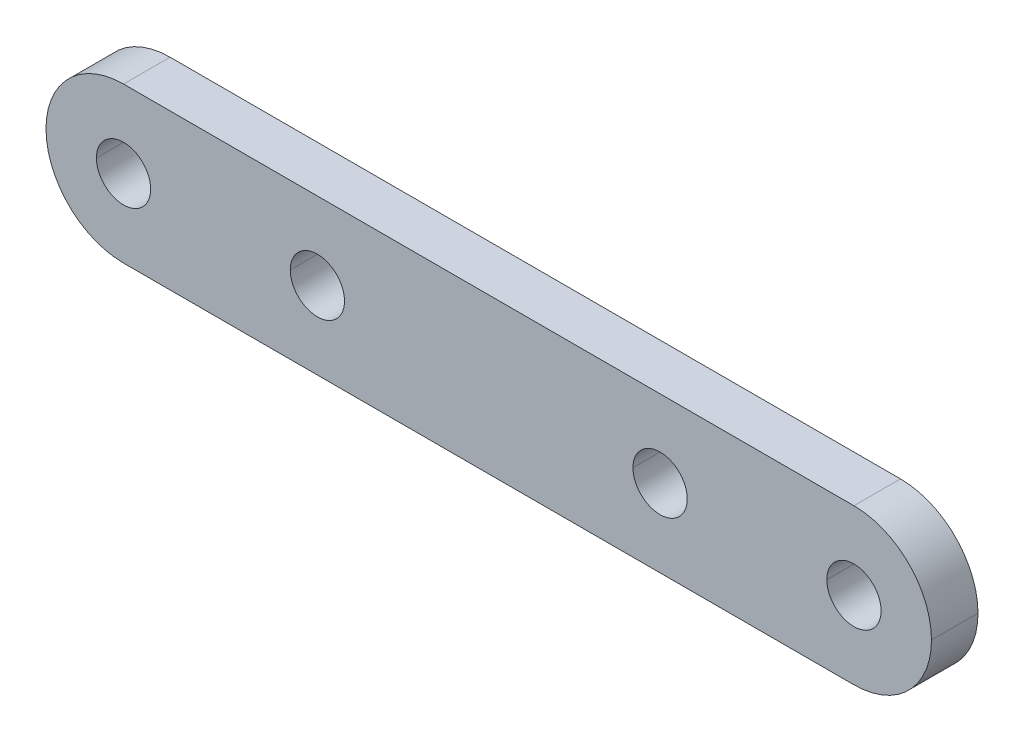
ISO-10303-21;
HEADER;
FILE_DESCRIPTION(('STEP AP214'),'2;1');
FILE_NAME('part.step','',(''),(''),'','','');
FILE_SCHEMA(('AUTOMOTIVE_DESIGN { 1 0 10303 214 1 1 1 1 }'));
ENDSEC;
DATA;
#1=APPLICATION_CONTEXT('core data for automotive mechanical design processes');
#2=APPLICATION_PROTOCOL_DEFINITION('international standard','automotive_design',2000,#1);
#3=PRODUCT_CONTEXT('',#1,'mechanical');
#4=PRODUCT('Part','Part','',(#3));
#5=PRODUCT_RELATED_PRODUCT_CATEGORY('part','',(#4));
#6=PRODUCT_DEFINITION_FORMATION('','',#4);
#7=PRODUCT_DEFINITION_CONTEXT('part definition',#1,'design');
#8=PRODUCT_DEFINITION('design','',#6,#7);
#9=PRODUCT_DEFINITION_SHAPE('','',#8);
#10=(LENGTH_UNIT() NAMED_UNIT(*) SI_UNIT(.MILLI.,.METRE.));
#11=(NAMED_UNIT(*) PLANE_ANGLE_UNIT() SI_UNIT($,.RADIAN.));
#12=(NAMED_UNIT(*) SI_UNIT($,.STERADIAN.) SOLID_ANGLE_UNIT());
#13=UNCERTAINTY_MEASURE_WITH_UNIT(LENGTH_MEASURE(1.E-05),#10,'distance_accuracy_value','');
#14=(GEOMETRIC_REPRESENTATION_CONTEXT(3) GLOBAL_UNCERTAINTY_ASSIGNED_CONTEXT((#13)) GLOBAL_UNIT_ASSIGNED_CONTEXT((#10,
#11,#12)) REPRESENTATION_CONTEXT('',''));
#15=CARTESIAN_POINT('',(0.,0.,0.));
#16=DIRECTION('',(0.,0.,1.));
#17=DIRECTION('',(1.,0.,0.));
#18=AXIS2_PLACEMENT_3D('',#15,#16,#17);
#19=CARTESIAN_POINT('',(11.0499999999999,6.,14.9713085751982));
#20=DIRECTION('',(0.,0.,1.));
#21=DIRECTION('',(1.,0.,0.));
#22=AXIS2_PLACEMENT_3D('',#19,#20,#21);
#23=CYLINDRICAL_SURFACE('',#22,1.75);
#24=DIRECTION('',(0.,0.,1.));
#25=VECTOR('',#24,1.);
#26=CARTESIAN_POINT('',(9.29999999999988,6.,14.9713085751982));
#27=LINE('',#26,#25);
#28=CARTESIAN_POINT('',(9.29999999999988,6.,14.9713085751982));
#29=VERTEX_POINT('',#28);
#30=CARTESIAN_POINT('',(9.29999999999987,6.,17.9713085751983));
#31=VERTEX_POINT('',#30);
#32=EDGE_CURVE('E240',#29,#31,#27,.T.);
#33=ORIENTED_EDGE('',*,*,#32,.F.);
#34=CARTESIAN_POINT('',(11.0499999999999,6.,14.9713085751982));
#35=DIRECTION('',(0.,0.,-1.));
#36=DIRECTION('',(-1.,0.,0.));
#37=AXIS2_PLACEMENT_3D('',#34,#35,#36);
#38=CIRCLE('',#37,1.75);
#39=CARTESIAN_POINT('',(12.7999999999999,6.,14.9713085751982));
#40=VERTEX_POINT('',#39);
#41=EDGE_CURVE('E87',#29,#40,#38,.T.);
#42=ORIENTED_EDGE('',*,*,#41,.T.);
#43=DIRECTION('',(0.,0.,1.));
#44=VECTOR('',#43,1.);
#45=CARTESIAN_POINT('',(12.7999999999999,6.,14.9713085751982));
#46=LINE('',#45,#44);
#47=CARTESIAN_POINT('',(12.7999999999999,6.,17.9713085751983));
#48=VERTEX_POINT('',#47);
#49=EDGE_CURVE('E228',#40,#48,#46,.T.);
#50=ORIENTED_EDGE('',*,*,#49,.T.);
#51=CARTESIAN_POINT('',(11.0499999999999,6.,17.9713085751983));
#52=DIRECTION('',(0.,0.,-1.));
#53=DIRECTION('',(-1.,0.,0.));
#54=AXIS2_PLACEMENT_3D('',#51,#52,#53);
#55=CIRCLE('',#54,1.75);
#56=EDGE_CURVE('E107',#31,#48,#55,.T.);
#57=ORIENTED_EDGE('',*,*,#56,.F.);
#58=EDGE_LOOP('',(#33,#42,#50,#57));
#59=FACE_BOUND('',#58,.T.);
#60=ADVANCED_FACE('F16',(#59),#23,.F.);
#61=CARTESIAN_POINT('',(23.55,6.,14.9713085751983));
#62=DIRECTION('',(0.,0.,1.));
#63=DIRECTION('',(1.,0.,0.));
#64=AXIS2_PLACEMENT_3D('',#61,#62,#63);
#65=CYLINDRICAL_SURFACE('',#64,1.75);
#66=DIRECTION('',(0.,0.,1.));
#67=VECTOR('',#66,1.);
#68=CARTESIAN_POINT('',(21.8,6.,14.9713085751983));
#69=LINE('',#68,#67);
#70=CARTESIAN_POINT('',(21.8,6.,14.9713085751983));
#71=VERTEX_POINT('',#70);
#72=CARTESIAN_POINT('',(21.8,6.,17.9713085751983));
#73=VERTEX_POINT('',#72);
#74=EDGE_CURVE('E211',#71,#73,#69,.T.);
#75=ORIENTED_EDGE('',*,*,#74,.F.);
#76=CARTESIAN_POINT('',(23.55,6.,14.9713085751983));
#77=DIRECTION('',(0.,0.,-1.));
#78=DIRECTION('',(-1.,0.,0.));
#79=AXIS2_PLACEMENT_3D('',#76,#77,#78);
#80=CIRCLE('',#79,1.75);
#81=CARTESIAN_POINT('',(25.3,6.,14.9713085751983));
#82=VERTEX_POINT('',#81);
#83=EDGE_CURVE('E143',#71,#82,#80,.T.);
#84=ORIENTED_EDGE('',*,*,#83,.T.);
#85=DIRECTION('',(0.,0.,1.));
#86=VECTOR('',#85,1.);
#87=CARTESIAN_POINT('',(25.3,6.,14.9713085751983));
#88=LINE('',#87,#86);
#89=CARTESIAN_POINT('',(25.3,6.,17.9713085751983));
#90=VERTEX_POINT('',#89);
#91=EDGE_CURVE('E203',#82,#90,#88,.T.);
#92=ORIENTED_EDGE('',*,*,#91,.T.);
#93=CARTESIAN_POINT('',(23.55,6.,17.9713085751983));
#94=DIRECTION('',(0.,0.,-1.));
#95=DIRECTION('',(-1.,0.,0.));
#96=AXIS2_PLACEMENT_3D('',#93,#94,#95);
#97=CIRCLE('',#96,1.75);
#98=EDGE_CURVE('E103',#73,#90,#97,.T.);
#99=ORIENTED_EDGE('',*,*,#98,.F.);
#100=EDGE_LOOP('',(#75,#84,#92,#99));
#101=FACE_BOUND('',#100,.T.);
#102=ADVANCED_FACE('F465',(#101),#65,.F.);
#103=CARTESIAN_POINT('',(0.,0.999999999999965,14.9713085751982));
#104=DIRECTION('',(0.,1.,0.));
#105=DIRECTION('',(1.,0.,0.));
#106=AXIS2_PLACEMENT_3D('',#103,#104,#105);
#107=PLANE('',#106);
#108=DIRECTION('',(-1.,0.,0.));
#109=VECTOR('',#108,1.);
#110=CARTESIAN_POINT('',(0.,0.999999999999966,17.9713085751982));
#111=LINE('',#110,#109);
#112=CARTESIAN_POINT('',(23.55,1.,17.9713085751983));
#113=VERTEX_POINT('',#112);
#114=CARTESIAN_POINT('',(-23.55,0.999999999999933,17.9713085751982));
#115=VERTEX_POINT('',#114);
#116=EDGE_CURVE('E72',#113,#115,#111,.T.);
#117=ORIENTED_EDGE('',*,*,#116,.T.);
#118=DIRECTION('',(0.,0.,1.));
#119=VECTOR('',#118,1.);
#120=CARTESIAN_POINT('',(-23.55,0.999999999999933,14.9713085751982));
#121=LINE('',#120,#119);
#122=CARTESIAN_POINT('',(-23.55,0.999999999999933,14.9713085751982));
#123=VERTEX_POINT('',#122);
#124=EDGE_CURVE('E26',#123,#115,#121,.T.);
#125=ORIENTED_EDGE('',*,*,#124,.F.);
#126=DIRECTION('',(-1.,0.,0.));
#127=VECTOR('',#126,1.);
#128=CARTESIAN_POINT('',(0.,0.999999999999965,14.9713085751982));
#129=LINE('',#128,#127);
#130=CARTESIAN_POINT('',(23.55,1.,14.9713085751983));
#131=VERTEX_POINT('',#130);
#132=EDGE_CURVE('E130',#131,#123,#129,.T.);
#133=ORIENTED_EDGE('',*,*,#132,.F.);
#134=DIRECTION('',(0.,0.,1.));
#135=VECTOR('',#134,1.);
#136=CARTESIAN_POINT('',(23.55,1.,14.9713085751983));
#137=LINE('',#136,#135);
#138=EDGE_CURVE('E75',#131,#113,#137,.T.);
#139=ORIENTED_EDGE('',*,*,#138,.T.);
#140=EDGE_LOOP('',(#117,#125,#133,#139));
#141=FACE_BOUND('',#140,.T.);
#142=ADVANCED_FACE('F18',(#141),#107,.F.);
#143=CARTESIAN_POINT('',(-11.05,6.,14.9713085751982));
#144=DIRECTION('',(0.,0.,1.));
#145=DIRECTION('',(1.,0.,0.));
#146=AXIS2_PLACEMENT_3D('',#143,#144,#145);
#147=CYLINDRICAL_SURFACE('',#146,1.75);
#148=DIRECTION('',(0.,0.,1.));
#149=VECTOR('',#148,1.);
#150=CARTESIAN_POINT('',(-12.8,6.,14.9713085751982));
#151=LINE('',#150,#149);
#152=CARTESIAN_POINT('',(-12.8,6.,14.9713085751982));
#153=VERTEX_POINT('',#152);
#154=CARTESIAN_POINT('',(-12.8,6.,17.9713085751982));
#155=VERTEX_POINT('',#154);
#156=EDGE_CURVE('E222',#153,#155,#151,.T.);
#157=ORIENTED_EDGE('',*,*,#156,.F.);
#158=CARTESIAN_POINT('',(-11.05,6.,14.9713085751982));
#159=DIRECTION('',(0.,0.,-1.));
#160=DIRECTION('',(-1.,0.,0.));
#161=AXIS2_PLACEMENT_3D('',#158,#159,#160);
#162=CIRCLE('',#161,1.75);
#163=CARTESIAN_POINT('',(-9.3,6.,14.9713085751982));
#164=VERTEX_POINT('',#163);
#165=EDGE_CURVE('E94',#153,#164,#162,.T.);
#166=ORIENTED_EDGE('',*,*,#165,.T.);
#167=DIRECTION('',(0.,0.,1.));
#168=VECTOR('',#167,1.);
#169=CARTESIAN_POINT('',(-9.3,6.,14.9713085751982));
#170=LINE('',#169,#168);
#171=CARTESIAN_POINT('',(-9.3,6.,17.9713085751982));
#172=VERTEX_POINT('',#171);
#173=EDGE_CURVE('E202',#164,#172,#170,.T.);
#174=ORIENTED_EDGE('',*,*,#173,.T.);
#175=CARTESIAN_POINT('',(-11.05,6.,17.9713085751982));
#176=DIRECTION('',(0.,0.,-1.));
#177=DIRECTION('',(-1.,0.,0.));
#178=AXIS2_PLACEMENT_3D('',#175,#176,#177);
#179=CIRCLE('',#178,1.75);
#180=EDGE_CURVE('E102',#155,#172,#179,.T.);
#181=ORIENTED_EDGE('',*,*,#180,.F.);
#182=EDGE_LOOP('',(#157,#166,#174,#181));
#183=FACE_BOUND('',#182,.T.);
#184=ADVANCED_FACE('F464',(#183),#147,.F.);
#185=CARTESIAN_POINT('',(-23.55,6.,14.9713085751982));
#186=DIRECTION('',(0.,0.,1.));
#187=DIRECTION('',(1.,0.,0.));
#188=AXIS2_PLACEMENT_3D('',#185,#186,#187);
#189=CYLINDRICAL_SURFACE('',#188,1.75);
#190=DIRECTION('',(0.,0.,1.));
#191=VECTOR('',#190,1.);
#192=CARTESIAN_POINT('',(-25.3,6.,14.9713085751982));
#193=LINE('',#192,#191);
#194=CARTESIAN_POINT('',(-25.3,6.,14.9713085751982));
#195=VERTEX_POINT('',#194);
#196=CARTESIAN_POINT('',(-25.3,6.,17.9713085751982));
#197=VERTEX_POINT('',#196);
#198=EDGE_CURVE('E178',#195,#197,#193,.T.);
#199=ORIENTED_EDGE('',*,*,#198,.F.);
#200=CARTESIAN_POINT('',(-23.55,6.,14.9713085751982));
#201=DIRECTION('',(0.,0.,-1.));
#202=DIRECTION('',(-1.,0.,0.));
#203=AXIS2_PLACEMENT_3D('',#200,#201,#202);
#204=CIRCLE('',#203,1.75);
#205=CARTESIAN_POINT('',(-21.8,6.,14.9713085751982));
#206=VERTEX_POINT('',#205);
#207=EDGE_CURVE('E97',#195,#206,#204,.T.);
#208=ORIENTED_EDGE('',*,*,#207,.T.);
#209=DIRECTION('',(0.,0.,1.));
#210=VECTOR('',#209,1.);
#211=CARTESIAN_POINT('',(-21.8,6.,14.9713085751982));
#212=LINE('',#211,#210);
#213=CARTESIAN_POINT('',(-21.8,6.,17.9713085751982));
#214=VERTEX_POINT('',#213);
#215=EDGE_CURVE('E180',#206,#214,#212,.T.);
#216=ORIENTED_EDGE('',*,*,#215,.T.);
#217=CARTESIAN_POINT('',(-23.55,6.,17.9713085751982));
#218=DIRECTION('',(0.,0.,-1.));
#219=DIRECTION('',(-1.,0.,0.));
#220=AXIS2_PLACEMENT_3D('',#217,#218,#219);
#221=CIRCLE('',#220,1.75);
#222=EDGE_CURVE('E108',#197,#214,#221,.T.);
#223=ORIENTED_EDGE('',*,*,#222,.F.);
#224=EDGE_LOOP('',(#199,#208,#216,#223));
#225=FACE_BOUND('',#224,.T.);
#226=ADVANCED_FACE('F271',(#225),#189,.F.);
#227=CARTESIAN_POINT('',(23.55,6.,14.9713085751983));
#228=DIRECTION('',(0.,0.,1.));
#229=DIRECTION('',(1.,0.,0.));
#230=AXIS2_PLACEMENT_3D('',#227,#228,#229);
#231=CYLINDRICAL_SURFACE('',#230,5.);
#232=DIRECTION('',(0.,0.,1.));
#233=VECTOR('',#232,1.);
#234=CARTESIAN_POINT('',(28.55,6.,14.9713085751983));
#235=LINE('',#234,#233);
#236=CARTESIAN_POINT('',(28.55,6.,14.9713085751983));
#237=VERTEX_POINT('',#236);
#238=CARTESIAN_POINT('',(28.55,6.,17.9713085751983));
#239=VERTEX_POINT('',#238);
#240=EDGE_CURVE('E185',#237,#239,#235,.T.);
#241=ORIENTED_EDGE('',*,*,#240,.F.);
#242=CARTESIAN_POINT('',(23.55,6.,14.9713085751983));
#243=DIRECTION('',(0.,0.,-1.));
#244=DIRECTION('',(-1.,0.,0.));
#245=AXIS2_PLACEMENT_3D('',#242,#243,#244);
#246=CIRCLE('',#245,5.);
#247=CARTESIAN_POINT('',(23.55,11.,14.9713085751983));
#248=VERTEX_POINT('',#247);
#249=EDGE_CURVE('E126',#248,#237,#246,.T.);
#250=ORIENTED_EDGE('',*,*,#249,.F.);
#251=DIRECTION('',(0.,0.,1.));
#252=VECTOR('',#251,1.);
#253=CARTESIAN_POINT('',(23.55,11.,14.9713085751983));
#254=LINE('',#253,#252);
#255=CARTESIAN_POINT('',(23.55,11.,17.9713085751983));
#256=VERTEX_POINT('',#255);
#257=EDGE_CURVE('E10',#248,#256,#254,.T.);
#258=ORIENTED_EDGE('',*,*,#257,.T.);
#259=CARTESIAN_POINT('',(23.55,6.,17.9713085751983));
#260=DIRECTION('',(0.,0.,-1.));
#261=DIRECTION('',(-1.,0.,0.));
#262=AXIS2_PLACEMENT_3D('',#259,#260,#261);
#263=CIRCLE('',#262,5.);
#264=EDGE_CURVE('E80',#256,#239,#263,.T.);
#265=ORIENTED_EDGE('',*,*,#264,.T.);
#266=EDGE_LOOP('',(#241,#250,#258,#265));
#267=FACE_BOUND('',#266,.T.);
#268=ADVANCED_FACE('F485',(#267),#231,.T.);
#269=CARTESIAN_POINT('',(0.,11.,14.9713085751982));
#270=DIRECTION('',(0.,1.,0.));
#271=DIRECTION('',(1.,0.,0.));
#272=AXIS2_PLACEMENT_3D('',#269,#270,#271);
#273=PLANE('',#272);
#274=DIRECTION('',(-1.,0.,0.));
#275=VECTOR('',#274,1.);
#276=CARTESIAN_POINT('',(0.,11.,17.9713085751982));
#277=LINE('',#276,#275);
#278=CARTESIAN_POINT('',(-23.55,11.,17.9713085751982));
#279=VERTEX_POINT('',#278);
#280=EDGE_CURVE('E85',#256,#279,#277,.T.);
#281=ORIENTED_EDGE('',*,*,#280,.F.);
#282=ORIENTED_EDGE('',*,*,#257,.F.);
#283=DIRECTION('',(-1.,0.,0.));
#284=VECTOR('',#283,1.);
#285=CARTESIAN_POINT('',(0.,11.,14.9713085751982));
#286=LINE('',#285,#284);
#287=CARTESIAN_POINT('',(-23.55,11.,14.9713085751982));
#288=VERTEX_POINT('',#287);
#289=EDGE_CURVE('E122',#248,#288,#286,.T.);
#290=ORIENTED_EDGE('',*,*,#289,.T.);
#291=DIRECTION('',(0.,0.,1.));
#292=VECTOR('',#291,1.);
#293=CARTESIAN_POINT('',(-23.55,11.,14.9713085751982));
#294=LINE('',#293,#292);
#295=EDGE_CURVE('E69',#288,#279,#294,.T.);
#296=ORIENTED_EDGE('',*,*,#295,.T.);
#297=EDGE_LOOP('',(#281,#282,#290,#296));
#298=FACE_BOUND('',#297,.T.);
#299=ADVANCED_FACE('F120',(#298),#273,.T.);
#300=CARTESIAN_POINT('',(-23.55,6.,14.9713085751982));
#301=DIRECTION('',(0.,0.,1.));
#302=DIRECTION('',(1.,0.,0.));
#303=AXIS2_PLACEMENT_3D('',#300,#301,#302);
#304=CYLINDRICAL_SURFACE('',#303,5.);
#305=CARTESIAN_POINT('',(-23.55,6.,17.9713085751982));
#306=DIRECTION('',(0.,0.,-1.));
#307=DIRECTION('',(-1.,0.,0.));
#308=AXIS2_PLACEMENT_3D('',#305,#306,#307);
#309=CIRCLE('',#308,5.);
#310=EDGE_CURVE('E62',#115,#279,#309,.T.);
#311=ORIENTED_EDGE('',*,*,#310,.T.);
#312=ORIENTED_EDGE('',*,*,#295,.F.);
#313=CARTESIAN_POINT('',(-23.55,6.,14.9713085751982));
#314=DIRECTION('',(0.,0.,-1.));
#315=DIRECTION('',(-1.,0.,0.));
#316=AXIS2_PLACEMENT_3D('',#313,#314,#315);
#317=CIRCLE('',#316,5.);
#318=EDGE_CURVE('E64',#123,#288,#317,.T.);
#319=ORIENTED_EDGE('',*,*,#318,.F.);
#320=ORIENTED_EDGE('',*,*,#124,.T.);
#321=EDGE_LOOP('',(#311,#312,#319,#320));
#322=FACE_BOUND('',#321,.T.);
#323=ADVANCED_FACE('F60',(#322),#304,.T.);
#324=CARTESIAN_POINT('',(0.,0.,17.9713085751982));
#325=DIRECTION('',(0.,0.,-1.));
#326=DIRECTION('',(0.,-1.,0.));
#327=AXIS2_PLACEMENT_3D('',#324,#325,#326);
#328=PLANE('',#327);
#329=CARTESIAN_POINT('',(11.0499999999999,6.,17.9713085751983));
#330=DIRECTION('',(0.,0.,-1.));
#331=DIRECTION('',(-1.,0.,0.));
#332=AXIS2_PLACEMENT_3D('',#329,#330,#331);
#333=CIRCLE('',#332,1.75);
#334=EDGE_CURVE('E235',#48,#31,#333,.T.);
#335=ORIENTED_EDGE('',*,*,#334,.T.);
#336=ORIENTED_EDGE('',*,*,#56,.T.);
#337=EDGE_LOOP('',(#335,#336));
#338=FACE_BOUND('',#337,.T.);
#339=CARTESIAN_POINT('',(23.55,6.,17.9713085751983));
#340=DIRECTION('',(0.,0.,-1.));
#341=DIRECTION('',(-1.,0.,0.));
#342=AXIS2_PLACEMENT_3D('',#339,#340,#341);
#343=CIRCLE('',#342,1.75);
#344=EDGE_CURVE('E207',#90,#73,#343,.T.);
#345=ORIENTED_EDGE('',*,*,#344,.T.);
#346=ORIENTED_EDGE('',*,*,#98,.T.);
#347=EDGE_LOOP('',(#345,#346));
#348=FACE_BOUND('',#347,.T.);
#349=CARTESIAN_POINT('',(-23.55,6.,17.9713085751982));
#350=DIRECTION('',(0.,0.,-1.));
#351=DIRECTION('',(-1.,0.,0.));
#352=AXIS2_PLACEMENT_3D('',#349,#350,#351);
#353=CIRCLE('',#352,1.75);
#354=EDGE_CURVE('E183',#214,#197,#353,.T.);
#355=ORIENTED_EDGE('',*,*,#354,.T.);
#356=ORIENTED_EDGE('',*,*,#222,.T.);
#357=EDGE_LOOP('',(#355,#356));
#358=FACE_BOUND('',#357,.T.);
#359=CARTESIAN_POINT('',(-11.05,6.,17.9713085751982));
#360=DIRECTION('',(0.,0.,-1.));
#361=DIRECTION('',(-1.,0.,0.));
#362=AXIS2_PLACEMENT_3D('',#359,#360,#361);
#363=CIRCLE('',#362,1.75);
#364=EDGE_CURVE('E232',#172,#155,#363,.T.);
#365=ORIENTED_EDGE('',*,*,#364,.T.);
#366=ORIENTED_EDGE('',*,*,#180,.T.);
#367=EDGE_LOOP('',(#365,#366));
#368=FACE_BOUND('',#367,.T.);
#369=ORIENTED_EDGE('',*,*,#310,.F.);
#370=ORIENTED_EDGE('',*,*,#116,.F.);
#371=CARTESIAN_POINT('',(23.55,6.,17.9713085751983));
#372=DIRECTION('',(0.,0.,-1.));
#373=DIRECTION('',(-1.,0.,0.));
#374=AXIS2_PLACEMENT_3D('',#371,#372,#373);
#375=CIRCLE('',#374,5.);
#376=EDGE_CURVE('E136',#239,#113,#375,.T.);
#377=ORIENTED_EDGE('',*,*,#376,.F.);
#378=ORIENTED_EDGE('',*,*,#264,.F.);
#379=ORIENTED_EDGE('',*,*,#280,.T.);
#380=EDGE_LOOP('',(#369,#370,#377,#378,#379));
#381=FACE_BOUND('',#380,.T.);
#382=ADVANCED_FACE('F83',(#338,#348,#358,#368,#381),#328,.F.);
#383=CARTESIAN_POINT('',(0.,0.,14.9713085751982));
#384=DIRECTION('',(0.,0.,-1.));
#385=DIRECTION('',(0.,-1.,0.));
#386=AXIS2_PLACEMENT_3D('',#383,#384,#385);
#387=PLANE('',#386);
#388=CARTESIAN_POINT('',(11.0499999999999,6.,14.9713085751982));
#389=DIRECTION('',(0.,0.,-1.));
#390=DIRECTION('',(-1.,0.,0.));
#391=AXIS2_PLACEMENT_3D('',#388,#389,#390);
#392=CIRCLE('',#391,1.75);
#393=EDGE_CURVE('E246',#40,#29,#392,.T.);
#394=ORIENTED_EDGE('',*,*,#393,.F.);
#395=ORIENTED_EDGE('',*,*,#41,.F.);
#396=EDGE_LOOP('',(#394,#395));
#397=FACE_BOUND('',#396,.T.);
#398=CARTESIAN_POINT('',(-11.05,6.,14.9713085751982));
#399=DIRECTION('',(0.,0.,-1.));
#400=DIRECTION('',(-1.,0.,0.));
#401=AXIS2_PLACEMENT_3D('',#398,#399,#400);
#402=CIRCLE('',#401,1.75);
#403=EDGE_CURVE('E206',#164,#153,#402,.T.);
#404=ORIENTED_EDGE('',*,*,#403,.F.);
#405=ORIENTED_EDGE('',*,*,#165,.F.);
#406=EDGE_LOOP('',(#404,#405));
#407=FACE_BOUND('',#406,.T.);
#408=CARTESIAN_POINT('',(-23.55,6.,14.9713085751982));
#409=DIRECTION('',(0.,0.,-1.));
#410=DIRECTION('',(-1.,0.,0.));
#411=AXIS2_PLACEMENT_3D('',#408,#409,#410);
#412=CIRCLE('',#411,1.75);
#413=EDGE_CURVE('E199',#206,#195,#412,.T.);
#414=ORIENTED_EDGE('',*,*,#413,.F.);
#415=ORIENTED_EDGE('',*,*,#207,.F.);
#416=EDGE_LOOP('',(#414,#415));
#417=FACE_BOUND('',#416,.T.);
#418=CARTESIAN_POINT('',(23.55,6.,14.9713085751983));
#419=DIRECTION('',(0.,0.,-1.));
#420=DIRECTION('',(-1.,0.,0.));
#421=AXIS2_PLACEMENT_3D('',#418,#419,#420);
#422=CIRCLE('',#421,1.75);
#423=EDGE_CURVE('E215',#82,#71,#422,.T.);
#424=ORIENTED_EDGE('',*,*,#423,.F.);
#425=ORIENTED_EDGE('',*,*,#83,.F.);
#426=EDGE_LOOP('',(#424,#425));
#427=FACE_BOUND('',#426,.T.);
#428=ORIENTED_EDGE('',*,*,#318,.T.);
#429=ORIENTED_EDGE('',*,*,#289,.F.);
#430=ORIENTED_EDGE('',*,*,#249,.T.);
#431=CARTESIAN_POINT('',(23.55,6.,14.9713085751983));
#432=DIRECTION('',(0.,0.,-1.));
#433=DIRECTION('',(-1.,0.,0.));
#434=AXIS2_PLACEMENT_3D('',#431,#432,#433);
#435=CIRCLE('',#434,5.);
#436=EDGE_CURVE('E182',#237,#131,#435,.T.);
#437=ORIENTED_EDGE('',*,*,#436,.T.);
#438=ORIENTED_EDGE('',*,*,#132,.T.);
#439=EDGE_LOOP('',(#428,#429,#430,#437,#438));
#440=FACE_BOUND('',#439,.T.);
#441=ADVANCED_FACE('F128',(#397,#407,#417,#427,#440),#387,.T.);
#442=CARTESIAN_POINT('',(23.55,6.,14.9713085751983));
#443=DIRECTION('',(0.,0.,1.));
#444=DIRECTION('',(1.,0.,0.));
#445=AXIS2_PLACEMENT_3D('',#442,#443,#444);
#446=CYLINDRICAL_SURFACE('',#445,5.);
#447=ORIENTED_EDGE('',*,*,#436,.F.);
#448=ORIENTED_EDGE('',*,*,#240,.T.);
#449=ORIENTED_EDGE('',*,*,#376,.T.);
#450=ORIENTED_EDGE('',*,*,#138,.F.);
#451=EDGE_LOOP('',(#447,#448,#449,#450));
#452=FACE_BOUND('',#451,.T.);
#453=ADVANCED_FACE('F516',(#452),#446,.T.);
#454=CARTESIAN_POINT('',(-23.55,6.,14.9713085751982));
#455=DIRECTION('',(0.,0.,1.));
#456=DIRECTION('',(1.,0.,0.));
#457=AXIS2_PLACEMENT_3D('',#454,#455,#456);
#458=CYLINDRICAL_SURFACE('',#457,1.75);
#459=ORIENTED_EDGE('',*,*,#413,.T.);
#460=ORIENTED_EDGE('',*,*,#198,.T.);
#461=ORIENTED_EDGE('',*,*,#354,.F.);
#462=ORIENTED_EDGE('',*,*,#215,.F.);
#463=EDGE_LOOP('',(#459,#460,#461,#462));
#464=FACE_BOUND('',#463,.T.);
#465=ADVANCED_FACE('F264',(#464),#458,.F.);
#466=CARTESIAN_POINT('',(-11.05,6.,14.9713085751982));
#467=DIRECTION('',(0.,0.,1.));
#468=DIRECTION('',(1.,0.,0.));
#469=AXIS2_PLACEMENT_3D('',#466,#467,#468);
#470=CYLINDRICAL_SURFACE('',#469,1.75);
#471=ORIENTED_EDGE('',*,*,#403,.T.);
#472=ORIENTED_EDGE('',*,*,#156,.T.);
#473=ORIENTED_EDGE('',*,*,#364,.F.);
#474=ORIENTED_EDGE('',*,*,#173,.F.);
#475=EDGE_LOOP('',(#471,#472,#473,#474));
#476=FACE_BOUND('',#475,.T.);
#477=ADVANCED_FACE('F515',(#476),#470,.F.);
#478=CARTESIAN_POINT('',(23.55,6.,14.9713085751983));
#479=DIRECTION('',(0.,0.,1.));
#480=DIRECTION('',(1.,0.,0.));
#481=AXIS2_PLACEMENT_3D('',#478,#479,#480);
#482=CYLINDRICAL_SURFACE('',#481,1.75);
#483=ORIENTED_EDGE('',*,*,#423,.T.);
#484=ORIENTED_EDGE('',*,*,#74,.T.);
#485=ORIENTED_EDGE('',*,*,#344,.F.);
#486=ORIENTED_EDGE('',*,*,#91,.F.);
#487=EDGE_LOOP('',(#483,#484,#485,#486));
#488=FACE_BOUND('',#487,.T.);
#489=ADVANCED_FACE('F524',(#488),#482,.F.);
#490=CARTESIAN_POINT('',(11.0499999999999,6.,14.9713085751982));
#491=DIRECTION('',(0.,0.,1.));
#492=DIRECTION('',(1.,0.,0.));
#493=AXIS2_PLACEMENT_3D('',#490,#491,#492);
#494=CYLINDRICAL_SURFACE('',#493,1.75);
#495=ORIENTED_EDGE('',*,*,#393,.T.);
#496=ORIENTED_EDGE('',*,*,#32,.T.);
#497=ORIENTED_EDGE('',*,*,#334,.F.);
#498=ORIENTED_EDGE('',*,*,#49,.F.);
#499=EDGE_LOOP('',(#495,#496,#497,#498));
#500=FACE_BOUND('',#499,.T.);
#501=ADVANCED_FACE('F540',(#500),#494,.F.);
#502=CLOSED_SHELL('',(#60,#102,#142,#184,#226,#268,#299,#323,#382,#441,#453,#465,#477,#489,#501));
#503=MANIFOLD_SOLID_BREP('B1',#502);
#504=ADVANCED_BREP_SHAPE_REPRESENTATION('',(#18,#503),#14);
#505=SHAPE_DEFINITION_REPRESENTATION(#9,#504);
ENDSEC;
END-ISO-10303-21;
